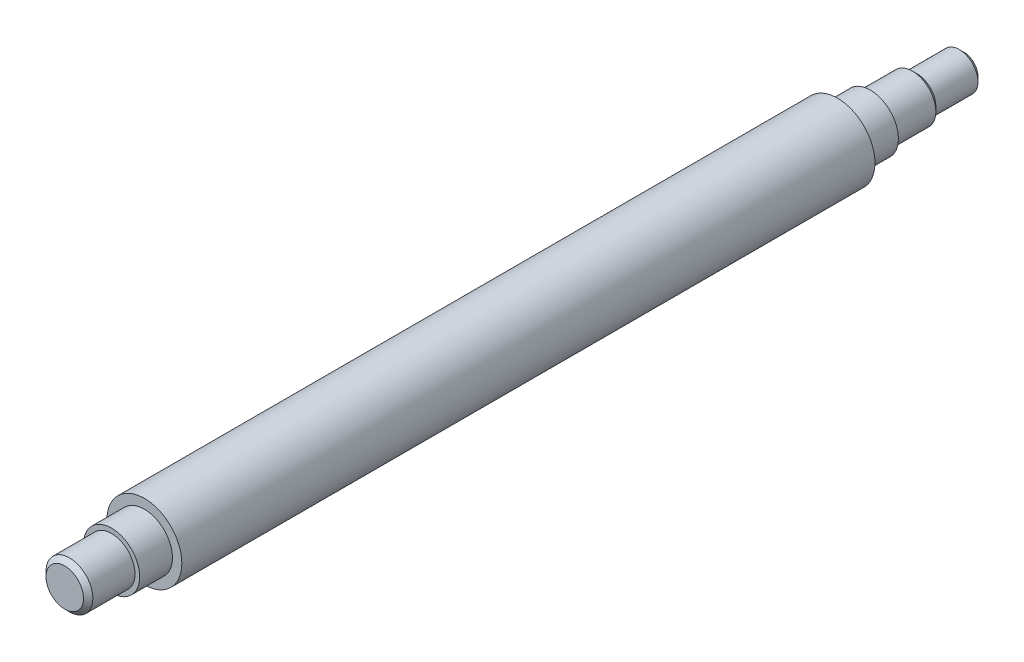
ISO-10303-21;
HEADER;
FILE_DESCRIPTION(('STEP AP214'),'2;1');
FILE_NAME('part.step','',(''),(''),'','','');
FILE_SCHEMA(('AUTOMOTIVE_DESIGN { 1 0 10303 214 1 1 1 1 }'));
ENDSEC;
DATA;
#1=APPLICATION_CONTEXT('core data for automotive mechanical design processes');
#2=APPLICATION_PROTOCOL_DEFINITION('international standard','automotive_design',2000,#1);
#3=PRODUCT_CONTEXT('',#1,'mechanical');
#4=PRODUCT('Part','Part','',(#3));
#5=PRODUCT_RELATED_PRODUCT_CATEGORY('part','',(#4));
#6=PRODUCT_DEFINITION_FORMATION('','',#4);
#7=PRODUCT_DEFINITION_CONTEXT('part definition',#1,'design');
#8=PRODUCT_DEFINITION('design','',#6,#7);
#9=PRODUCT_DEFINITION_SHAPE('','',#8);
#10=(LENGTH_UNIT() NAMED_UNIT(*) SI_UNIT(.MILLI.,.METRE.));
#11=(NAMED_UNIT(*) PLANE_ANGLE_UNIT() SI_UNIT($,.RADIAN.));
#12=(NAMED_UNIT(*) SI_UNIT($,.STERADIAN.) SOLID_ANGLE_UNIT());
#13=UNCERTAINTY_MEASURE_WITH_UNIT(LENGTH_MEASURE(1.E-05),#10,'distance_accuracy_value','');
#14=(GEOMETRIC_REPRESENTATION_CONTEXT(3) GLOBAL_UNCERTAINTY_ASSIGNED_CONTEXT((#13)) GLOBAL_UNIT_ASSIGNED_CONTEXT((#10,
#11,#12)) REPRESENTATION_CONTEXT('',''));
#15=CARTESIAN_POINT('',(0.,0.,0.));
#16=DIRECTION('',(0.,0.,1.));
#17=DIRECTION('',(1.,0.,0.));
#18=AXIS2_PLACEMENT_3D('',#15,#16,#17);
#19=CARTESIAN_POINT('',(0.,0.,155.));
#20=DIRECTION('',(0.,0.,1.));
#21=DIRECTION('',(1.,0.,0.));
#22=AXIS2_PLACEMENT_3D('',#19,#20,#21);
#23=PLANE('',#22);
#24=CARTESIAN_POINT('',(0.,0.,155.));
#25=DIRECTION('',(0.,0.,1.));
#26=DIRECTION('',(1.,0.,0.));
#27=AXIS2_PLACEMENT_3D('',#24,#25,#26);
#28=CIRCLE('',#27,6.);
#29=CARTESIAN_POINT('',(6.,0.,155.));
#30=VERTEX_POINT('',#29);
#31=EDGE_CURVE('E74',#30,#30,#28,.T.);
#32=ORIENTED_EDGE('',*,*,#31,.T.);
#33=EDGE_LOOP('',(#32));
#34=FACE_BOUND('',#33,.T.);
#35=CARTESIAN_POINT('',(0.,0.,155.));
#36=DIRECTION('',(0.,0.,1.));
#37=DIRECTION('',(1.,0.,0.));
#38=AXIS2_PLACEMENT_3D('',#35,#36,#37);
#39=CIRCLE('',#38,5.);
#40=CARTESIAN_POINT('',(5.,0.,155.));
#41=VERTEX_POINT('',#40);
#42=EDGE_CURVE('E77',#41,#41,#39,.T.);
#43=ORIENTED_EDGE('',*,*,#42,.F.);
#44=EDGE_LOOP('',(#43));
#45=FACE_BOUND('',#44,.T.);
#46=ADVANCED_FACE('F30',(#34,#45),#23,.T.);
#47=CARTESIAN_POINT('',(0.,0.,148.));
#48=DIRECTION('',(0.,0.,1.));
#49=DIRECTION('',(1.,0.,0.));
#50=AXIS2_PLACEMENT_3D('',#47,#48,#49);
#51=PLANE('',#50);
#52=CARTESIAN_POINT('',(0.,0.,148.));
#53=DIRECTION('',(0.,0.,1.));
#54=DIRECTION('',(1.,0.,0.));
#55=AXIS2_PLACEMENT_3D('',#52,#53,#54);
#56=CIRCLE('',#55,8.);
#57=CARTESIAN_POINT('',(8.,0.,148.));
#58=VERTEX_POINT('',#57);
#59=EDGE_CURVE('E56',#58,#58,#56,.T.);
#60=ORIENTED_EDGE('',*,*,#59,.T.);
#61=EDGE_LOOP('',(#60));
#62=FACE_BOUND('',#61,.T.);
#63=CARTESIAN_POINT('',(0.,0.,148.));
#64=DIRECTION('',(0.,0.,1.));
#65=DIRECTION('',(1.,0.,0.));
#66=AXIS2_PLACEMENT_3D('',#63,#64,#65);
#67=CIRCLE('',#66,6.);
#68=CARTESIAN_POINT('',(6.,0.,148.));
#69=VERTEX_POINT('',#68);
#70=EDGE_CURVE('E71',#69,#69,#67,.T.);
#71=ORIENTED_EDGE('',*,*,#70,.F.);
#72=EDGE_LOOP('',(#71));
#73=FACE_BOUND('',#72,.T.);
#74=ADVANCED_FACE('F84',(#62,#73),#51,.T.);
#75=CARTESIAN_POINT('',(0.,0.,-7.));
#76=DIRECTION('',(0.,0.,-1.));
#77=DIRECTION('',(-1.,0.,0.));
#78=AXIS2_PLACEMENT_3D('',#75,#76,#77);
#79=PLANE('',#78);
#80=CARTESIAN_POINT('',(0.,0.,-7.));
#81=DIRECTION('',(0.,0.,-1.));
#82=DIRECTION('',(-1.,0.,0.));
#83=AXIS2_PLACEMENT_3D('',#80,#81,#82);
#84=CIRCLE('',#83,6.);
#85=CARTESIAN_POINT('',(-6.,0.,-7.));
#86=VERTEX_POINT('',#85);
#87=EDGE_CURVE('E60',#86,#86,#84,.T.);
#88=ORIENTED_EDGE('',*,*,#87,.T.);
#89=EDGE_LOOP('',(#88));
#90=FACE_BOUND('',#89,.T.);
#91=CARTESIAN_POINT('',(0.,0.,-7.));
#92=DIRECTION('',(0.,0.,-1.));
#93=DIRECTION('',(-1.,0.,0.));
#94=AXIS2_PLACEMENT_3D('',#91,#92,#93);
#95=CIRCLE('',#94,5.);
#96=CARTESIAN_POINT('',(-5.,0.,-7.));
#97=VERTEX_POINT('',#96);
#98=EDGE_CURVE('E65',#97,#97,#95,.T.);
#99=ORIENTED_EDGE('',*,*,#98,.F.);
#100=EDGE_LOOP('',(#99));
#101=FACE_BOUND('',#100,.T.);
#102=ADVANCED_FACE('F90',(#90,#101),#79,.T.);
#103=CARTESIAN_POINT('',(0.,0.,0.));
#104=DIRECTION('',(0.,0.,1.));
#105=DIRECTION('',(1.,0.,0.));
#106=AXIS2_PLACEMENT_3D('',#103,#104,#105);
#107=PLANE('',#106);
#108=CARTESIAN_POINT('',(0.,0.,0.));
#109=DIRECTION('',(0.,0.,1.));
#110=DIRECTION('',(1.,0.,0.));
#111=AXIS2_PLACEMENT_3D('',#108,#109,#110);
#112=CIRCLE('',#111,8.);
#113=CARTESIAN_POINT('',(8.,0.,0.));
#114=VERTEX_POINT('',#113);
#115=EDGE_CURVE('E57',#114,#114,#112,.T.);
#116=ORIENTED_EDGE('',*,*,#115,.F.);
#117=EDGE_LOOP('',(#116));
#118=FACE_BOUND('',#117,.T.);
#119=CARTESIAN_POINT('',(0.,0.,0.));
#120=DIRECTION('',(0.,0.,1.));
#121=DIRECTION('',(1.,0.,0.));
#122=AXIS2_PLACEMENT_3D('',#119,#120,#121);
#123=CIRCLE('',#122,6.);
#124=CARTESIAN_POINT('',(6.,0.,0.));
#125=VERTEX_POINT('',#124);
#126=EDGE_CURVE('E53',#125,#125,#123,.F.);
#127=ORIENTED_EDGE('',*,*,#126,.F.);
#128=EDGE_LOOP('',(#127));
#129=FACE_BOUND('',#128,.T.);
#130=ADVANCED_FACE('F117',(#118,#129),#107,.F.);
#131=CARTESIAN_POINT('',(0.,0.,148.));
#132=DIRECTION('',(0.,0.,-1.));
#133=DIRECTION('',(-1.,0.,0.));
#134=AXIS2_PLACEMENT_3D('',#131,#132,#133);
#135=CYLINDRICAL_SURFACE('',#134,8.);
#136=ORIENTED_EDGE('',*,*,#59,.F.);
#137=EDGE_LOOP('',(#136));
#138=FACE_BOUND('',#137,.T.);
#139=ORIENTED_EDGE('',*,*,#115,.T.);
#140=EDGE_LOOP('',(#139));
#141=FACE_BOUND('',#140,.T.);
#142=ADVANCED_FACE('F120',(#138,#141),#135,.T.);
#143=CARTESIAN_POINT('',(0.,0.,-5.));
#144=DIRECTION('',(0.,0.,1.));
#145=DIRECTION('',(1.,0.,0.));
#146=AXIS2_PLACEMENT_3D('',#143,#144,#145);
#147=CYLINDRICAL_SURFACE('',#146,6.);
#148=ORIENTED_EDGE('',*,*,#126,.T.);
#149=EDGE_LOOP('',(#148));
#150=FACE_BOUND('',#149,.T.);
#151=ORIENTED_EDGE('',*,*,#87,.F.);
#152=EDGE_LOOP('',(#151));
#153=FACE_BOUND('',#152,.T.);
#154=ADVANCED_FACE('F113',(#150,#153),#147,.T.);
#155=CARTESIAN_POINT('',(0.,0.,-17.));
#156=DIRECTION('',(0.,0.,1.));
#157=DIRECTION('',(1.,0.,0.));
#158=AXIS2_PLACEMENT_3D('',#155,#156,#157);
#159=CYLINDRICAL_SURFACE('',#158,5.);
#160=CARTESIAN_POINT('',(0.,0.,-16.));
#161=DIRECTION('',(0.,0.,-1.));
#162=DIRECTION('',(-1.,0.,0.));
#163=AXIS2_PLACEMENT_3D('',#160,#161,#162);
#164=CIRCLE('',#163,5.);
#165=CARTESIAN_POINT('',(-5.,0.,-16.));
#166=VERTEX_POINT('',#165);
#167=EDGE_CURVE('E50',#166,#166,#164,.F.);
#168=ORIENTED_EDGE('',*,*,#167,.T.);
#169=EDGE_LOOP('',(#168));
#170=FACE_BOUND('',#169,.T.);
#171=ORIENTED_EDGE('',*,*,#98,.T.);
#172=EDGE_LOOP('',(#171));
#173=FACE_BOUND('',#172,.T.);
#174=ADVANCED_FACE('F109',(#170,#173),#159,.T.);
#175=CARTESIAN_POINT('',(0.,0.,-27.));
#176=DIRECTION('',(0.,0.,1.));
#177=DIRECTION('',(1.,0.,0.));
#178=AXIS2_PLACEMENT_3D('',#175,#176,#177);
#179=CYLINDRICAL_SURFACE('',#178,4.);
#180=CARTESIAN_POINT('',(0.,0.,-26.));
#181=DIRECTION('',(0.,0.,-1.));
#182=DIRECTION('',(-1.,0.,0.));
#183=AXIS2_PLACEMENT_3D('',#180,#181,#182);
#184=CIRCLE('',#183,4.);
#185=CARTESIAN_POINT('',(-4.,0.,-26.));
#186=VERTEX_POINT('',#185);
#187=EDGE_CURVE('E41',#186,#186,#184,.F.);
#188=ORIENTED_EDGE('',*,*,#187,.T.);
#189=EDGE_LOOP('',(#188));
#190=FACE_BOUND('',#189,.T.);
#191=CARTESIAN_POINT('',(0.,0.,-17.));
#192=DIRECTION('',(0.,0.,-1.));
#193=DIRECTION('',(-1.,0.,0.));
#194=AXIS2_PLACEMENT_3D('',#191,#192,#193);
#195=CIRCLE('',#194,4.);
#196=CARTESIAN_POINT('',(-4.,0.,-17.));
#197=VERTEX_POINT('',#196);
#198=EDGE_CURVE('E68',#197,#197,#195,.T.);
#199=ORIENTED_EDGE('',*,*,#198,.T.);
#200=EDGE_LOOP('',(#199));
#201=FACE_BOUND('',#200,.T.);
#202=ADVANCED_FACE('F105',(#190,#201),#179,.T.);
#203=CARTESIAN_POINT('',(0.,0.,-27.));
#204=DIRECTION('',(0.,0.,-1.));
#205=DIRECTION('',(-1.,0.,0.));
#206=AXIS2_PLACEMENT_3D('',#203,#204,#205);
#207=PLANE('',#206);
#208=CARTESIAN_POINT('',(0.,0.,-27.));
#209=DIRECTION('',(0.,0.,-1.));
#210=DIRECTION('',(-1.,0.,0.));
#211=AXIS2_PLACEMENT_3D('',#208,#209,#210);
#212=CIRCLE('',#211,3.);
#213=CARTESIAN_POINT('',(-3.,0.,-27.));
#214=VERTEX_POINT('',#213);
#215=EDGE_CURVE('E45',#214,#214,#212,.T.);
#216=ORIENTED_EDGE('',*,*,#215,.T.);
#217=EDGE_LOOP('',(#216));
#218=FACE_BOUND('',#217,.T.);
#219=ADVANCED_FACE('F101',(#218),#207,.T.);
#220=CARTESIAN_POINT('',(0.,0.,-17.));
#221=DIRECTION('',(0.,0.,1.));
#222=DIRECTION('',(1.,0.,0.));
#223=AXIS2_PLACEMENT_3D('',#220,#221,#222);
#224=CONICAL_SURFACE('',#223,4.,0.785398163397439);
#225=ORIENTED_EDGE('',*,*,#167,.F.);
#226=EDGE_LOOP('',(#225));
#227=FACE_BOUND('',#226,.T.);
#228=ORIENTED_EDGE('',*,*,#198,.F.);
#229=EDGE_LOOP('',(#228));
#230=FACE_BOUND('',#229,.T.);
#231=ADVANCED_FACE('F104',(#227,#230),#224,.T.);
#232=CARTESIAN_POINT('',(0.,0.,-27.));
#233=DIRECTION('',(0.,0.,1.));
#234=DIRECTION('',(1.,0.,0.));
#235=AXIS2_PLACEMENT_3D('',#232,#233,#234);
#236=CONICAL_SURFACE('',#235,3.,0.785398163397441);
#237=ORIENTED_EDGE('',*,*,#187,.F.);
#238=EDGE_LOOP('',(#237));
#239=FACE_BOUND('',#238,.T.);
#240=ORIENTED_EDGE('',*,*,#215,.F.);
#241=EDGE_LOOP('',(#240));
#242=FACE_BOUND('',#241,.T.);
#243=ADVANCED_FACE('F99',(#239,#242),#236,.T.);
#244=CARTESIAN_POINT('',(0.,0.,153.));
#245=DIRECTION('',(0.,0.,-1.));
#246=DIRECTION('',(-1.,0.,0.));
#247=AXIS2_PLACEMENT_3D('',#244,#245,#246);
#248=CYLINDRICAL_SURFACE('',#247,6.);
#249=ORIENTED_EDGE('',*,*,#70,.T.);
#250=EDGE_LOOP('',(#249));
#251=FACE_BOUND('',#250,.T.);
#252=ORIENTED_EDGE('',*,*,#31,.F.);
#253=EDGE_LOOP('',(#252));
#254=FACE_BOUND('',#253,.T.);
#255=ADVANCED_FACE('F96',(#251,#254),#248,.T.);
#256=CARTESIAN_POINT('',(0.,0.,165.));
#257=DIRECTION('',(0.,0.,-1.));
#258=DIRECTION('',(-1.,0.,0.));
#259=AXIS2_PLACEMENT_3D('',#256,#257,#258);
#260=CYLINDRICAL_SURFACE('',#259,5.);
#261=CARTESIAN_POINT('',(0.,0.,164.));
#262=DIRECTION('',(0.,0.,1.));
#263=DIRECTION('',(1.,0.,0.));
#264=AXIS2_PLACEMENT_3D('',#261,#262,#263);
#265=CIRCLE('',#264,5.);
#266=CARTESIAN_POINT('',(5.,0.,164.));
#267=VERTEX_POINT('',#266);
#268=EDGE_CURVE('E10',#267,#267,#265,.F.);
#269=ORIENTED_EDGE('',*,*,#268,.T.);
#270=EDGE_LOOP('',(#269));
#271=FACE_BOUND('',#270,.T.);
#272=ORIENTED_EDGE('',*,*,#42,.T.);
#273=EDGE_LOOP('',(#272));
#274=FACE_BOUND('',#273,.T.);
#275=ADVANCED_FACE('F81',(#271,#274),#260,.T.);
#276=CARTESIAN_POINT('',(0.,0.,165.));
#277=DIRECTION('',(0.,0.,1.));
#278=DIRECTION('',(1.,0.,0.));
#279=AXIS2_PLACEMENT_3D('',#276,#277,#278);
#280=PLANE('',#279);
#281=CARTESIAN_POINT('',(0.,0.,165.));
#282=DIRECTION('',(0.,0.,1.));
#283=DIRECTION('',(1.,0.,0.));
#284=AXIS2_PLACEMENT_3D('',#281,#282,#283);
#285=CIRCLE('',#284,4.00000000000006);
#286=CARTESIAN_POINT('',(4.00000000000006,0.,165.));
#287=VERTEX_POINT('',#286);
#288=EDGE_CURVE('E37',#287,#287,#285,.T.);
#289=ORIENTED_EDGE('',*,*,#288,.T.);
#290=EDGE_LOOP('',(#289));
#291=FACE_BOUND('',#290,.T.);
#292=ADVANCED_FACE('F155',(#291),#280,.T.);
#293=CARTESIAN_POINT('',(0.,0.,165.));
#294=DIRECTION('',(0.,0.,-1.));
#295=DIRECTION('',(-1.,0.,0.));
#296=AXIS2_PLACEMENT_3D('',#293,#294,#295);
#297=CONICAL_SURFACE('',#296,4.00000000000006,0.785398163397446);
#298=ORIENTED_EDGE('',*,*,#268,.F.);
#299=EDGE_LOOP('',(#298));
#300=FACE_BOUND('',#299,.T.);
#301=ORIENTED_EDGE('',*,*,#288,.F.);
#302=EDGE_LOOP('',(#301));
#303=FACE_BOUND('',#302,.T.);
#304=ADVANCED_FACE('F32',(#300,#303),#297,.T.);
#305=CLOSED_SHELL('',(#46,#74,#102,#130,#142,#154,#174,#202,#219,#231,#243,#255,#275,#292,#304));
#306=MANIFOLD_SOLID_BREP('B2',#305);
#307=ADVANCED_BREP_SHAPE_REPRESENTATION('',(#18,#306),#14);
#308=SHAPE_DEFINITION_REPRESENTATION(#9,#307);
ENDSEC;
END-ISO-10303-21;
